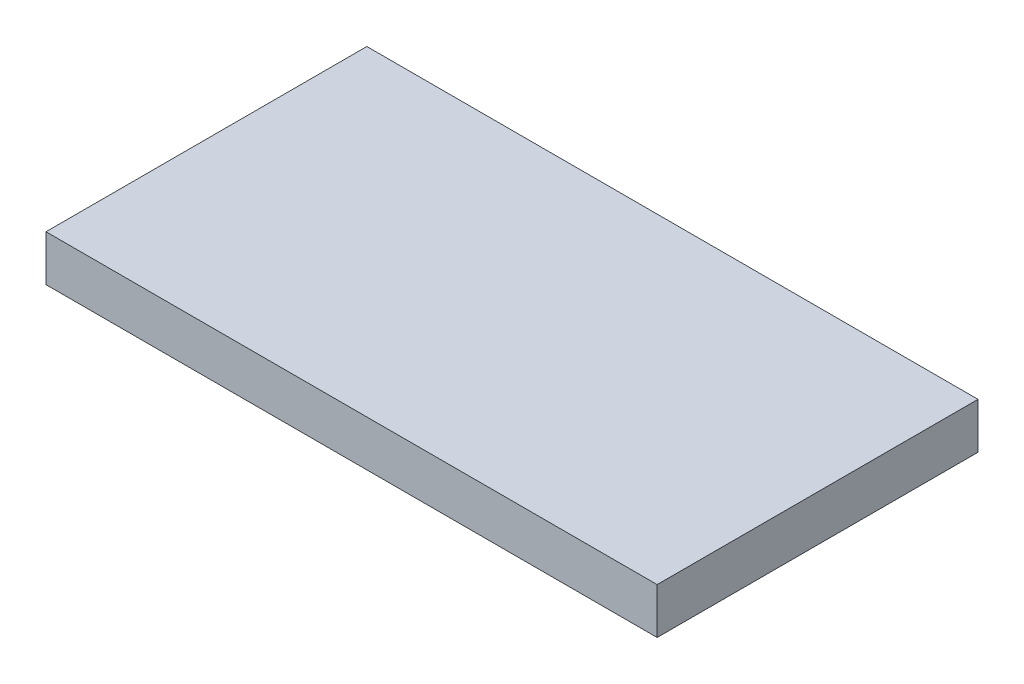
ISO-10303-21;
HEADER;
FILE_DESCRIPTION(('STEP AP214'),'2;1');
FILE_NAME('part.step','',(''),(''),'','','');
FILE_SCHEMA(('AUTOMOTIVE_DESIGN { 1 0 10303 214 1 1 1 1 }'));
ENDSEC;
DATA;
#1=APPLICATION_CONTEXT('core data for automotive mechanical design processes');
#2=APPLICATION_PROTOCOL_DEFINITION('international standard','automotive_design',2000,#1);
#3=PRODUCT_CONTEXT('',#1,'mechanical');
#4=PRODUCT('Part','Part','',(#3));
#5=PRODUCT_RELATED_PRODUCT_CATEGORY('part','',(#4));
#6=PRODUCT_DEFINITION_FORMATION('','',#4);
#7=PRODUCT_DEFINITION_CONTEXT('part definition',#1,'design');
#8=PRODUCT_DEFINITION('design','',#6,#7);
#9=PRODUCT_DEFINITION_SHAPE('','',#8);
#10=(LENGTH_UNIT() NAMED_UNIT(*) SI_UNIT(.MILLI.,.METRE.));
#11=(NAMED_UNIT(*) PLANE_ANGLE_UNIT() SI_UNIT($,.RADIAN.));
#12=(NAMED_UNIT(*) SI_UNIT($,.STERADIAN.) SOLID_ANGLE_UNIT());
#13=UNCERTAINTY_MEASURE_WITH_UNIT(LENGTH_MEASURE(1.E-05),#10,'distance_accuracy_value','');
#14=(GEOMETRIC_REPRESENTATION_CONTEXT(3) GLOBAL_UNCERTAINTY_ASSIGNED_CONTEXT((#13)) GLOBAL_UNIT_ASSIGNED_CONTEXT((#10,
#11,#12)) REPRESENTATION_CONTEXT('',''));
#15=CARTESIAN_POINT('',(0.,0.,0.));
#16=DIRECTION('',(0.,0.,1.));
#17=DIRECTION('',(1.,0.,0.));
#18=AXIS2_PLACEMENT_3D('',#15,#16,#17);
#19=CARTESIAN_POINT('',(-137.293586305676,-17.8557256767442,420.));
#20=DIRECTION('',(1.,0.,0.));
#21=DIRECTION('',(0.,0.,-1.));
#22=AXIS2_PLACEMENT_3D('',#19,#20,#21);
#23=PLANE('',#22);
#24=DIRECTION('',(0.,-1.,0.));
#25=VECTOR('',#24,1.);
#26=CARTESIAN_POINT('',(-137.293586305676,-17.8557256767442,0.));
#27=LINE('',#26,#25);
#28=CARTESIAN_POINT('',(-137.293586305676,-17.8557256767442,0.));
#29=VERTEX_POINT('',#28);
#30=CARTESIAN_POINT('',(-137.293586305676,-77.8557256767442,0.));
#31=VERTEX_POINT('',#30);
#32=EDGE_CURVE('E111',#29,#31,#27,.T.);
#33=ORIENTED_EDGE('',*,*,#32,.T.);
#34=DIRECTION('',(0.,0.,-1.));
#35=VECTOR('',#34,1.);
#36=CARTESIAN_POINT('',(-137.293586305676,-77.8557256767442,420.));
#37=LINE('',#36,#35);
#38=CARTESIAN_POINT('',(-137.293586305676,-77.8557256767442,420.));
#39=VERTEX_POINT('',#38);
#40=EDGE_CURVE('E11',#39,#31,#37,.T.);
#41=ORIENTED_EDGE('',*,*,#40,.F.);
#42=DIRECTION('',(0.,-1.,0.));
#43=VECTOR('',#42,1.);
#44=CARTESIAN_POINT('',(-137.293586305676,-17.8557256767442,420.));
#45=LINE('',#44,#43);
#46=CARTESIAN_POINT('',(-137.293586305676,-17.8557256767442,420.));
#47=VERTEX_POINT('',#46);
#48=EDGE_CURVE('E96',#47,#39,#45,.T.);
#49=ORIENTED_EDGE('',*,*,#48,.F.);
#50=DIRECTION('',(0.,0.,-1.));
#51=VECTOR('',#50,1.);
#52=CARTESIAN_POINT('',(-137.293586305676,-17.8557256767442,420.));
#53=LINE('',#52,#51);
#54=EDGE_CURVE('E109',#47,#29,#53,.T.);
#55=ORIENTED_EDGE('',*,*,#54,.T.);
#56=EDGE_LOOP('',(#33,#41,#49,#55));
#57=FACE_BOUND('',#56,.T.);
#58=ADVANCED_FACE('F44',(#57),#23,.F.);
#59=CARTESIAN_POINT('',(-137.293586305676,-77.8557256767442,420.));
#60=DIRECTION('',(0.,1.,0.));
#61=DIRECTION('',(0.,0.,1.));
#62=AXIS2_PLACEMENT_3D('',#59,#60,#61);
#63=PLANE('',#62);
#64=DIRECTION('',(1.,0.,0.));
#65=VECTOR('',#64,1.);
#66=CARTESIAN_POINT('',(-137.293586305676,-77.8557256767442,0.));
#67=LINE('',#66,#65);
#68=CARTESIAN_POINT('',(662.706413694324,-77.8557256767442,0.));
#69=VERTEX_POINT('',#68);
#70=EDGE_CURVE('E105',#31,#69,#67,.T.);
#71=ORIENTED_EDGE('',*,*,#70,.T.);
#72=DIRECTION('',(0.,0.,-1.));
#73=VECTOR('',#72,1.);
#74=CARTESIAN_POINT('',(662.706413694324,-77.8557256767442,420.));
#75=LINE('',#74,#73);
#76=CARTESIAN_POINT('',(662.706413694324,-77.8557256767442,420.));
#77=VERTEX_POINT('',#76);
#78=EDGE_CURVE('E53',#77,#69,#75,.T.);
#79=ORIENTED_EDGE('',*,*,#78,.F.);
#80=DIRECTION('',(1.,0.,0.));
#81=VECTOR('',#80,1.);
#82=CARTESIAN_POINT('',(-137.293586305676,-77.8557256767442,420.));
#83=LINE('',#82,#81);
#84=EDGE_CURVE('E89',#39,#77,#83,.T.);
#85=ORIENTED_EDGE('',*,*,#84,.F.);
#86=ORIENTED_EDGE('',*,*,#40,.T.);
#87=EDGE_LOOP('',(#71,#79,#85,#86));
#88=FACE_BOUND('',#87,.T.);
#89=ADVANCED_FACE('F101',(#88),#63,.F.);
#90=CARTESIAN_POINT('',(662.706413694324,-77.8557256767442,420.));
#91=DIRECTION('',(-1.,0.,0.));
#92=DIRECTION('',(0.,0.,1.));
#93=AXIS2_PLACEMENT_3D('',#90,#91,#92);
#94=PLANE('',#93);
#95=DIRECTION('',(0.,1.,0.));
#96=VECTOR('',#95,1.);
#97=CARTESIAN_POINT('',(662.706413694324,-77.8557256767442,0.));
#98=LINE('',#97,#96);
#99=CARTESIAN_POINT('',(662.706413694324,-17.8557256767442,0.));
#100=VERTEX_POINT('',#99);
#101=EDGE_CURVE('E116',#69,#100,#98,.T.);
#102=ORIENTED_EDGE('',*,*,#101,.T.);
#103=DIRECTION('',(0.,0.,-1.));
#104=VECTOR('',#103,1.);
#105=CARTESIAN_POINT('',(662.706413694324,-17.8557256767442,420.));
#106=LINE('',#105,#104);
#107=CARTESIAN_POINT('',(662.706413694324,-17.8557256767442,420.));
#108=VERTEX_POINT('',#107);
#109=EDGE_CURVE('E104',#108,#100,#106,.T.);
#110=ORIENTED_EDGE('',*,*,#109,.F.);
#111=DIRECTION('',(0.,1.,0.));
#112=VECTOR('',#111,1.);
#113=CARTESIAN_POINT('',(662.706413694324,-77.8557256767442,420.));
#114=LINE('',#113,#112);
#115=EDGE_CURVE('E91',#77,#108,#114,.T.);
#116=ORIENTED_EDGE('',*,*,#115,.F.);
#117=ORIENTED_EDGE('',*,*,#78,.T.);
#118=EDGE_LOOP('',(#102,#110,#116,#117));
#119=FACE_BOUND('',#118,.T.);
#120=ADVANCED_FACE('F106',(#119),#94,.F.);
#121=CARTESIAN_POINT('',(-37.2935863056763,-17.8557256767441,420.));
#122=DIRECTION('',(0.,-1.,0.));
#123=DIRECTION('',(1.,0.,0.));
#124=AXIS2_PLACEMENT_3D('',#121,#122,#123);
#125=PLANE('',#124);
#126=DIRECTION('',(-1.,0.,0.));
#127=VECTOR('',#126,1.);
#128=CARTESIAN_POINT('',(-37.2935863056763,-17.8557256767441,0.));
#129=LINE('',#128,#127);
#130=EDGE_CURVE('E80',#100,#29,#129,.T.);
#131=ORIENTED_EDGE('',*,*,#130,.T.);
#132=ORIENTED_EDGE('',*,*,#54,.F.);
#133=DIRECTION('',(-1.,0.,0.));
#134=VECTOR('',#133,1.);
#135=CARTESIAN_POINT('',(662.706413694324,-17.8557256767442,420.));
#136=LINE('',#135,#134);
#137=EDGE_CURVE('E64',#108,#47,#136,.T.);
#138=ORIENTED_EDGE('',*,*,#137,.F.);
#139=ORIENTED_EDGE('',*,*,#109,.T.);
#140=EDGE_LOOP('',(#131,#132,#138,#139));
#141=FACE_BOUND('',#140,.T.);
#142=ADVANCED_FACE('F126',(#141),#125,.F.);
#143=CARTESIAN_POINT('',(0.,0.,420.));
#144=DIRECTION('',(0.,0.,1.));
#145=DIRECTION('',(1.,0.,0.));
#146=AXIS2_PLACEMENT_3D('',#143,#144,#145);
#147=PLANE('',#146);
#148=ORIENTED_EDGE('',*,*,#48,.T.);
#149=ORIENTED_EDGE('',*,*,#84,.T.);
#150=ORIENTED_EDGE('',*,*,#115,.T.);
#151=ORIENTED_EDGE('',*,*,#137,.T.);
#152=EDGE_LOOP('',(#148,#149,#150,#151));
#153=FACE_BOUND('',#152,.T.);
#154=ADVANCED_FACE('F93',(#153),#147,.T.);
#155=CARTESIAN_POINT('',(0.,0.,0.));
#156=DIRECTION('',(0.,0.,1.));
#157=DIRECTION('',(1.,0.,0.));
#158=AXIS2_PLACEMENT_3D('',#155,#156,#157);
#159=PLANE('',#158);
#160=ORIENTED_EDGE('',*,*,#32,.F.);
#161=ORIENTED_EDGE('',*,*,#130,.F.);
#162=ORIENTED_EDGE('',*,*,#101,.F.);
#163=ORIENTED_EDGE('',*,*,#70,.F.);
#164=EDGE_LOOP('',(#160,#161,#162,#163));
#165=FACE_BOUND('',#164,.T.);
#166=ADVANCED_FACE('F133',(#165),#159,.F.);
#167=CLOSED_SHELL('',(#58,#89,#120,#142,#154,#166));
#168=MANIFOLD_SOLID_BREP('B2',#167);
#169=ADVANCED_BREP_SHAPE_REPRESENTATION('',(#18,#168),#14);
#170=SHAPE_DEFINITION_REPRESENTATION(#9,#169);
ENDSEC;
END-ISO-10303-21;
